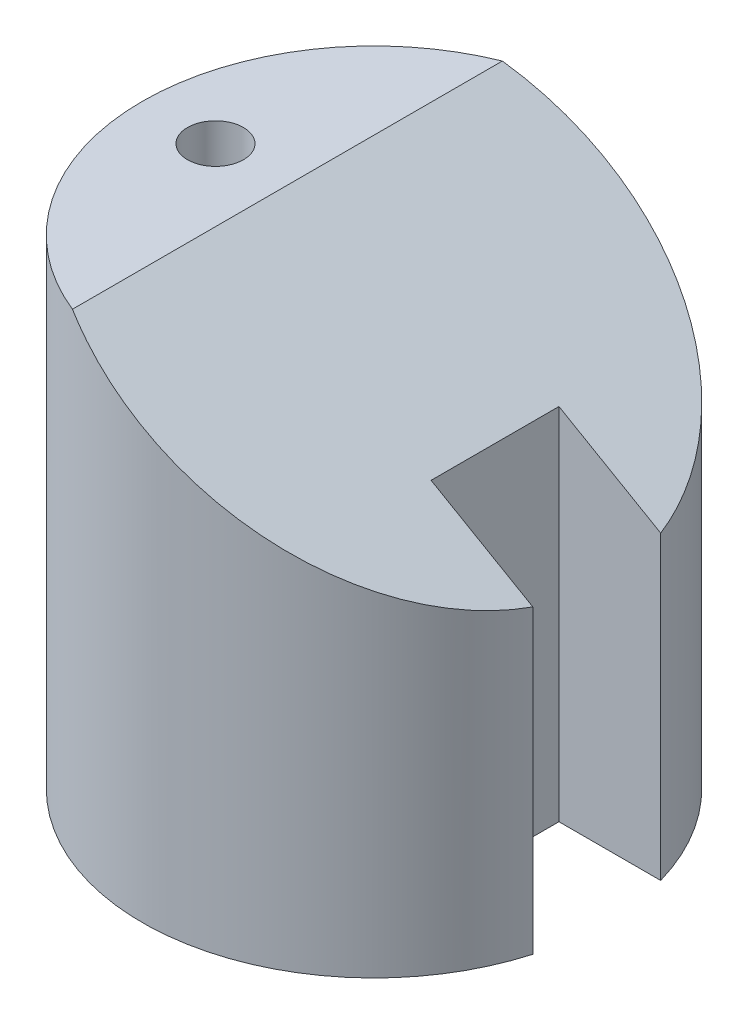
ISO-10303-21;
HEADER;
FILE_DESCRIPTION(('STEP AP214'),'2;1');
FILE_NAME('part.step','',(''),(''),'','','');
FILE_SCHEMA(('AUTOMOTIVE_DESIGN { 1 0 10303 214 1 1 1 1 }'));
ENDSEC;
DATA;
#1=APPLICATION_CONTEXT('core data for automotive mechanical design processes');
#2=APPLICATION_PROTOCOL_DEFINITION('international standard','automotive_design',2000,#1);
#3=PRODUCT_CONTEXT('',#1,'mechanical');
#4=PRODUCT('Part','Part','',(#3));
#5=PRODUCT_RELATED_PRODUCT_CATEGORY('part','',(#4));
#6=PRODUCT_DEFINITION_FORMATION('','',#4);
#7=PRODUCT_DEFINITION_CONTEXT('part definition',#1,'design');
#8=PRODUCT_DEFINITION('design','',#6,#7);
#9=PRODUCT_DEFINITION_SHAPE('','',#8);
#10=(LENGTH_UNIT() NAMED_UNIT(*) SI_UNIT(.MILLI.,.METRE.));
#11=(NAMED_UNIT(*) PLANE_ANGLE_UNIT() SI_UNIT($,.RADIAN.));
#12=(NAMED_UNIT(*) SI_UNIT($,.STERADIAN.) SOLID_ANGLE_UNIT());
#13=UNCERTAINTY_MEASURE_WITH_UNIT(LENGTH_MEASURE(1.E-05),#10,'distance_accuracy_value','');
#14=(GEOMETRIC_REPRESENTATION_CONTEXT(3) GLOBAL_UNCERTAINTY_ASSIGNED_CONTEXT((#13)) GLOBAL_UNIT_ASSIGNED_CONTEXT((#10,
#11,#12)) REPRESENTATION_CONTEXT('',''));
#15=CARTESIAN_POINT('',(0.,0.,0.));
#16=DIRECTION('',(0.,0.,1.));
#17=DIRECTION('',(1.,0.,0.));
#18=AXIS2_PLACEMENT_3D('',#15,#16,#17);
#19=CARTESIAN_POINT('',(0.,60.,0.));
#20=DIRECTION('',(0.,-1.,0.));
#21=DIRECTION('',(0.,0.,-1.));
#22=AXIS2_PLACEMENT_3D('',#19,#20,#21);
#23=CYLINDRICAL_SURFACE('',#22,29.);
#24=CARTESIAN_POINT('',(0.,0.,0.));
#25=DIRECTION('',(0.,1.,0.));
#26=DIRECTION('',(0.,0.,1.));
#27=AXIS2_PLACEMENT_3D('',#24,#25,#26);
#28=CIRCLE('',#27,29.);
#29=CARTESIAN_POINT('',(27.8747197295327,0.,-8.));
#30=VERTEX_POINT('',#29);
#31=CARTESIAN_POINT('',(27.8747197295327,0.,8.));
#32=VERTEX_POINT('',#31);
#33=EDGE_CURVE('E142',#30,#32,#28,.T.);
#34=ORIENTED_EDGE('',*,*,#33,.T.);
#35=DIRECTION('',(0.,-1.,0.));
#36=VECTOR('',#35,1.);
#37=CARTESIAN_POINT('',(27.8747197295327,60.,8.));
#38=LINE('',#37,#36);
#39=CARTESIAN_POINT('',(27.8747197295327,37.6496808670683,8.));
#40=VERTEX_POINT('',#39);
#41=EDGE_CURVE('E127',#32,#40,#38,.F.);
#42=ORIENTED_EDGE('',*,*,#41,.T.);
#43=CARTESIAN_POINT('',(0.,53.7431578064991,0.));
#44=DIRECTION('',(-0.499999999999995,-0.866025403784442,0.));
#45=DIRECTION('',(0.866025403784442,-0.499999999999995,0.));
#46=AXIS2_PLACEMENT_3D('',#43,#44,#45);
#47=ELLIPSE('',#46,33.4863156129982,29.);
#48=CARTESIAN_POINT('',(-10.8371685740843,60.,26.8989921241834));
#49=VERTEX_POINT('',#48);
#50=EDGE_CURVE('E136',#40,#49,#47,.T.);
#51=ORIENTED_EDGE('',*,*,#50,.T.);
#52=CARTESIAN_POINT('',(0.,60.,0.));
#53=DIRECTION('',(0.,1.,0.));
#54=DIRECTION('',(0.,0.,1.));
#55=AXIS2_PLACEMENT_3D('',#52,#53,#54);
#56=CIRCLE('',#55,29.);
#57=CARTESIAN_POINT('',(-10.8371685740843,60.,-26.8989921241834));
#58=VERTEX_POINT('',#57);
#59=EDGE_CURVE('E51',#58,#49,#56,.T.);
#60=ORIENTED_EDGE('',*,*,#59,.F.);
#61=CARTESIAN_POINT('',(27.8747197295327,37.6496808670683,-8.));
#62=VERTEX_POINT('',#61);
#63=EDGE_CURVE('E64',#58,#62,#47,.T.);
#64=ORIENTED_EDGE('',*,*,#63,.T.);
#65=DIRECTION('',(0.,-1.,0.));
#66=VECTOR('',#65,1.);
#67=CARTESIAN_POINT('',(27.8747197295327,60.,-8.));
#68=LINE('',#67,#66);
#69=EDGE_CURVE('E58',#30,#62,#68,.F.);
#70=ORIENTED_EDGE('',*,*,#69,.F.);
#71=EDGE_LOOP('',(#34,#42,#51,#60,#64,#70));
#72=FACE_BOUND('',#71,.T.);
#73=ADVANCED_FACE('F43',(#72),#23,.T.);
#74=CARTESIAN_POINT('',(0.,60.,0.));
#75=DIRECTION('',(0.,1.,0.));
#76=DIRECTION('',(0.,0.,1.));
#77=AXIS2_PLACEMENT_3D('',#74,#75,#76);
#78=PLANE('',#77);
#79=CARTESIAN_POINT('',(-19.8371685740843,60.,0.));
#80=DIRECTION('',(0.,1.,0.));
#81=DIRECTION('',(0.,0.,1.));
#82=AXIS2_PLACEMENT_3D('',#79,#80,#81);
#83=CIRCLE('',#82,3.5);
#84=CARTESIAN_POINT('',(-19.8371685740843,60.,3.5));
#85=VERTEX_POINT('',#84);
#86=EDGE_CURVE('E131',#85,#85,#83,.T.);
#87=ORIENTED_EDGE('',*,*,#86,.F.);
#88=EDGE_LOOP('',(#87));
#89=FACE_BOUND('',#88,.T.);
#90=DIRECTION('',(0.,0.,1.));
#91=VECTOR('',#90,1.);
#92=CARTESIAN_POINT('',(-10.8371685740843,60.,0.));
#93=LINE('',#92,#91);
#94=EDGE_CURVE('E11',#58,#49,#93,.T.);
#95=ORIENTED_EDGE('',*,*,#94,.F.);
#96=ORIENTED_EDGE('',*,*,#59,.T.);
#97=EDGE_LOOP('',(#95,#96));
#98=FACE_BOUND('',#97,.T.);
#99=ADVANCED_FACE('F167',(#89,#98),#78,.T.);
#100=CARTESIAN_POINT('',(0.,0.,0.));
#101=DIRECTION('',(0.,1.,0.));
#102=DIRECTION('',(0.,0.,1.));
#103=AXIS2_PLACEMENT_3D('',#100,#101,#102);
#104=PLANE('',#103);
#105=DIRECTION('',(0.,0.,1.));
#106=VECTOR('',#105,1.);
#107=CARTESIAN_POINT('',(15.1435935394489,0.,0.));
#108=LINE('',#107,#106);
#109=CARTESIAN_POINT('',(15.1435935394489,0.,-8.));
#110=VERTEX_POINT('',#109);
#111=CARTESIAN_POINT('',(15.1435935394489,0.,8.));
#112=VERTEX_POINT('',#111);
#113=EDGE_CURVE('E98',#110,#112,#108,.T.);
#114=ORIENTED_EDGE('',*,*,#113,.T.);
#115=DIRECTION('',(1.,0.,0.));
#116=VECTOR('',#115,1.);
#117=CARTESIAN_POINT('',(0.,0.,8.));
#118=LINE('',#117,#116);
#119=EDGE_CURVE('E123',#112,#32,#118,.T.);
#120=ORIENTED_EDGE('',*,*,#119,.T.);
#121=ORIENTED_EDGE('',*,*,#33,.F.);
#122=DIRECTION('',(1.,0.,0.));
#123=VECTOR('',#122,1.);
#124=CARTESIAN_POINT('',(0.,0.,-8.));
#125=LINE('',#124,#123);
#126=EDGE_CURVE('E115',#110,#30,#125,.T.);
#127=ORIENTED_EDGE('',*,*,#126,.F.);
#128=EDGE_LOOP('',(#114,#120,#121,#127));
#129=FACE_BOUND('',#128,.T.);
#130=ADVANCED_FACE('F150',(#129),#104,.F.);
#131=CARTESIAN_POINT('',(-10.8371685740843,60.,-30.));
#132=DIRECTION('',(-0.499999999999995,-0.866025403784442,0.));
#133=DIRECTION('',(0.866025403784442,-0.499999999999995,0.));
#134=AXIS2_PLACEMENT_3D('',#131,#132,#133);
#135=PLANE('',#134);
#136=ORIENTED_EDGE('',*,*,#50,.F.);
#137=DIRECTION('',(0.866025403784442,-0.499999999999995,0.));
#138=VECTOR('',#137,1.);
#139=CARTESIAN_POINT('',(15.1435935394489,45.0000000000001,8.));
#140=LINE('',#139,#138);
#141=CARTESIAN_POINT('',(15.1435935394489,45.0000000000001,8.));
#142=VERTEX_POINT('',#141);
#143=EDGE_CURVE('E106',#142,#40,#140,.T.);
#144=ORIENTED_EDGE('',*,*,#143,.F.);
#145=DIRECTION('',(0.,0.,1.));
#146=VECTOR('',#145,1.);
#147=CARTESIAN_POINT('',(15.1435935394489,45.0000000000001,-8.));
#148=LINE('',#147,#146);
#149=CARTESIAN_POINT('',(15.1435935394489,45.0000000000001,-8.));
#150=VERTEX_POINT('',#149);
#151=EDGE_CURVE('E95',#150,#142,#148,.T.);
#152=ORIENTED_EDGE('',*,*,#151,.F.);
#153=DIRECTION('',(0.866025403784442,-0.499999999999995,0.));
#154=VECTOR('',#153,1.);
#155=CARTESIAN_POINT('',(15.1435935394489,45.0000000000001,-8.));
#156=LINE('',#155,#154);
#157=EDGE_CURVE('E103',#150,#62,#156,.T.);
#158=ORIENTED_EDGE('',*,*,#157,.T.);
#159=ORIENTED_EDGE('',*,*,#63,.F.);
#160=ORIENTED_EDGE('',*,*,#94,.T.);
#161=EDGE_LOOP('',(#136,#144,#152,#158,#159,#160));
#162=FACE_BOUND('',#161,.T.);
#163=ADVANCED_FACE('F109',(#162),#135,.F.);
#164=CARTESIAN_POINT('',(-19.8371685740843,40.,0.));
#165=DIRECTION('',(0.,1.,0.));
#166=DIRECTION('',(0.,0.,1.));
#167=AXIS2_PLACEMENT_3D('',#164,#165,#166);
#168=CYLINDRICAL_SURFACE('',#167,3.5);
#169=CARTESIAN_POINT('',(-19.8371685740843,40.,0.));
#170=DIRECTION('',(0.,1.,0.));
#171=DIRECTION('',(0.,0.,1.));
#172=AXIS2_PLACEMENT_3D('',#169,#170,#171);
#173=CIRCLE('',#172,3.5);
#174=CARTESIAN_POINT('',(-19.8371685740843,40.,3.5));
#175=VERTEX_POINT('',#174);
#176=EDGE_CURVE('E132',#175,#175,#173,.T.);
#177=ORIENTED_EDGE('',*,*,#176,.F.);
#178=EDGE_LOOP('',(#177));
#179=FACE_BOUND('',#178,.T.);
#180=ORIENTED_EDGE('',*,*,#86,.T.);
#181=EDGE_LOOP('',(#180));
#182=FACE_BOUND('',#181,.T.);
#183=ADVANCED_FACE('F162',(#179,#182),#168,.F.);
#184=CARTESIAN_POINT('',(-19.8371685740843,40.,0.));
#185=DIRECTION('',(0.,1.,0.));
#186=DIRECTION('',(0.,0.,1.));
#187=AXIS2_PLACEMENT_3D('',#184,#185,#186);
#188=PLANE('',#187);
#189=ORIENTED_EDGE('',*,*,#176,.T.);
#190=EDGE_LOOP('',(#189));
#191=FACE_BOUND('',#190,.T.);
#192=ADVANCED_FACE('F155',(#191),#188,.T.);
#193=CARTESIAN_POINT('',(15.1435935394489,-15.9999999999999,8.));
#194=DIRECTION('',(0.,0.,1.));
#195=DIRECTION('',(1.,0.,0.));
#196=AXIS2_PLACEMENT_3D('',#193,#194,#195);
#197=PLANE('',#196);
#198=ORIENTED_EDGE('',*,*,#119,.F.);
#199=DIRECTION('',(0.,1.,0.));
#200=VECTOR('',#199,1.);
#201=CARTESIAN_POINT('',(15.1435935394489,-15.9999999999999,8.));
#202=LINE('',#201,#200);
#203=EDGE_CURVE('E101',#112,#142,#202,.T.);
#204=ORIENTED_EDGE('',*,*,#203,.T.);
#205=ORIENTED_EDGE('',*,*,#143,.T.);
#206=ORIENTED_EDGE('',*,*,#41,.F.);
#207=EDGE_LOOP('',(#198,#204,#205,#206));
#208=FACE_BOUND('',#207,.T.);
#209=ADVANCED_FACE('F152',(#208),#197,.F.);
#210=CARTESIAN_POINT('',(15.1435935394489,-15.9999999999999,-8.));
#211=DIRECTION('',(-1.,0.,0.));
#212=DIRECTION('',(0.,0.,1.));
#213=AXIS2_PLACEMENT_3D('',#210,#211,#212);
#214=PLANE('',#213);
#215=DIRECTION('',(0.,1.,0.));
#216=VECTOR('',#215,1.);
#217=CARTESIAN_POINT('',(15.1435935394489,-15.9999999999999,-8.));
#218=LINE('',#217,#216);
#219=EDGE_CURVE('E91',#110,#150,#218,.T.);
#220=ORIENTED_EDGE('',*,*,#219,.T.);
#221=ORIENTED_EDGE('',*,*,#151,.T.);
#222=ORIENTED_EDGE('',*,*,#203,.F.);
#223=ORIENTED_EDGE('',*,*,#113,.F.);
#224=EDGE_LOOP('',(#220,#221,#222,#223));
#225=FACE_BOUND('',#224,.T.);
#226=ADVANCED_FACE('F92',(#225),#214,.F.);
#227=CARTESIAN_POINT('',(15.1435935394489,-15.9999999999999,-8.));
#228=DIRECTION('',(0.,0.,1.));
#229=DIRECTION('',(1.,0.,0.));
#230=AXIS2_PLACEMENT_3D('',#227,#228,#229);
#231=PLANE('',#230);
#232=ORIENTED_EDGE('',*,*,#69,.T.);
#233=ORIENTED_EDGE('',*,*,#157,.F.);
#234=ORIENTED_EDGE('',*,*,#219,.F.);
#235=ORIENTED_EDGE('',*,*,#126,.T.);
#236=EDGE_LOOP('',(#232,#233,#234,#235));
#237=FACE_BOUND('',#236,.T.);
#238=ADVANCED_FACE('F104',(#237),#231,.T.);
#239=CLOSED_SHELL('',(#73,#99,#130,#163,#183,#192,#209,#226,#238));
#240=MANIFOLD_SOLID_BREP('B2',#239);
#241=ADVANCED_BREP_SHAPE_REPRESENTATION('',(#18,#240),#14);
#242=SHAPE_DEFINITION_REPRESENTATION(#9,#241);
ENDSEC;
END-ISO-10303-21;
